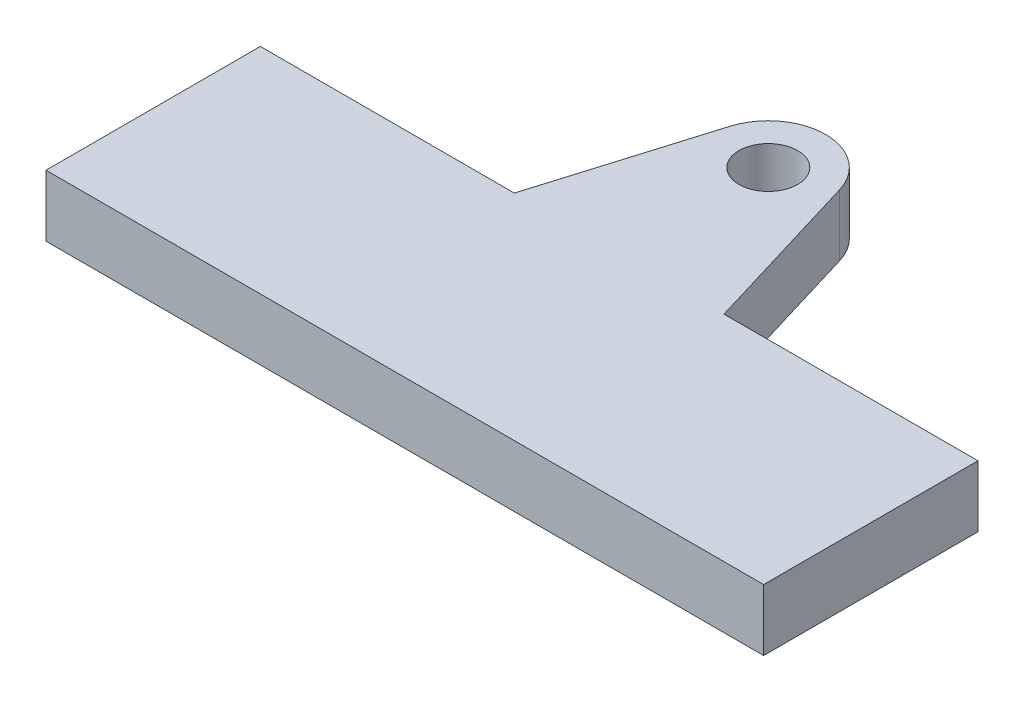
ISO-10303-21;
HEADER;
FILE_DESCRIPTION(('STEP AP214'),'2;1');
FILE_NAME('part.step','',(''),(''),'','','');
FILE_SCHEMA(('AUTOMOTIVE_DESIGN { 1 0 10303 214 1 1 1 1 }'));
ENDSEC;
DATA;
#1=APPLICATION_CONTEXT('core data for automotive mechanical design processes');
#2=APPLICATION_PROTOCOL_DEFINITION('international standard','automotive_design',2000,#1);
#3=PRODUCT_CONTEXT('',#1,'mechanical');
#4=PRODUCT('Part','Part','',(#3));
#5=PRODUCT_RELATED_PRODUCT_CATEGORY('part','',(#4));
#6=PRODUCT_DEFINITION_FORMATION('','',#4);
#7=PRODUCT_DEFINITION_CONTEXT('part definition',#1,'design');
#8=PRODUCT_DEFINITION('design','',#6,#7);
#9=PRODUCT_DEFINITION_SHAPE('','',#8);
#10=(LENGTH_UNIT() NAMED_UNIT(*) SI_UNIT(.MILLI.,.METRE.));
#11=(NAMED_UNIT(*) PLANE_ANGLE_UNIT() SI_UNIT($,.RADIAN.));
#12=(NAMED_UNIT(*) SI_UNIT($,.STERADIAN.) SOLID_ANGLE_UNIT());
#13=UNCERTAINTY_MEASURE_WITH_UNIT(LENGTH_MEASURE(1.E-05),#10,'distance_accuracy_value','');
#14=(GEOMETRIC_REPRESENTATION_CONTEXT(3) GLOBAL_UNCERTAINTY_ASSIGNED_CONTEXT((#13)) GLOBAL_UNIT_ASSIGNED_CONTEXT((#10,
#11,#12)) REPRESENTATION_CONTEXT('',''));
#15=CARTESIAN_POINT('',(0.,0.,0.));
#16=DIRECTION('',(0.,0.,1.));
#17=DIRECTION('',(1.,0.,0.));
#18=AXIS2_PLACEMENT_3D('',#15,#16,#17);
#19=CARTESIAN_POINT('',(0.,6.6,-16.));
#20=DIRECTION('',(0.,-1.,0.));
#21=DIRECTION('',(0.,0.,-1.));
#22=AXIS2_PLACEMENT_3D('',#19,#20,#21);
#23=CYLINDRICAL_SURFACE('',#22,6.15);
#24=CARTESIAN_POINT('',(0.,0.,-16.));
#25=DIRECTION('',(0.,1.,0.));
#26=DIRECTION('',(0.,0.,1.));
#27=AXIS2_PLACEMENT_3D('',#24,#25,#26);
#28=CIRCLE('',#27,6.15);
#29=CARTESIAN_POINT('',(-5.88800135866091,0.,-17.7759335574304));
#30=VERTEX_POINT('',#29);
#31=CARTESIAN_POINT('',(5.88800135866091,0.,-17.7759335574304));
#32=VERTEX_POINT('',#31);
#33=EDGE_CURVE('E197',#30,#32,#28,.F.);
#34=ORIENTED_EDGE('',*,*,#33,.F.);
#35=DIRECTION('',(0.,-1.,0.));
#36=VECTOR('',#35,1.);
#37=CARTESIAN_POINT('',(-5.88800135866091,6.6,-17.7759335574304));
#38=LINE('',#37,#36);
#39=CARTESIAN_POINT('',(-5.88800135866091,6.6,-17.7759335574304));
#40=VERTEX_POINT('',#39);
#41=EDGE_CURVE('E11',#40,#30,#38,.T.);
#42=ORIENTED_EDGE('',*,*,#41,.F.);
#43=CARTESIAN_POINT('',(0.,6.6,-16.));
#44=DIRECTION('',(0.,1.,0.));
#45=DIRECTION('',(0.,0.,1.));
#46=AXIS2_PLACEMENT_3D('',#43,#44,#45);
#47=CIRCLE('',#46,6.15);
#48=CARTESIAN_POINT('',(5.88800135866091,6.6,-17.7759335574304));
#49=VERTEX_POINT('',#48);
#50=EDGE_CURVE('E156',#40,#49,#47,.F.);
#51=ORIENTED_EDGE('',*,*,#50,.T.);
#52=DIRECTION('',(0.,-1.,0.));
#53=VECTOR('',#52,1.);
#54=CARTESIAN_POINT('',(5.88800135866091,6.6,-17.7759335574304));
#55=LINE('',#54,#53);
#56=EDGE_CURVE('E64',#49,#32,#55,.T.);
#57=ORIENTED_EDGE('',*,*,#56,.T.);
#58=EDGE_LOOP('',(#34,#42,#51,#57));
#59=FACE_BOUND('',#58,.T.);
#60=ADVANCED_FACE('F47',(#59),#23,.T.);
#61=CARTESIAN_POINT('',(-10.3114843961297,6.6,-3.11014044503737));
#62=DIRECTION('',(-0.957398594904213,0.,-0.288769684135018));
#63=DIRECTION('',(-0.288769684135018,0.,0.957398594904213));
#64=AXIS2_PLACEMENT_3D('',#61,#62,#63);
#65=PLANE('',#64);
#66=DIRECTION('',(0.288769684135018,0.,-0.957398594904213));
#67=VECTOR('',#66,1.);
#68=CARTESIAN_POINT('',(-10.3114843961297,0.,-3.11014044503737));
#69=LINE('',#68,#67);
#70=CARTESIAN_POINT('',(-11.2495620982584,0.,0.));
#71=VERTEX_POINT('',#70);
#72=EDGE_CURVE('E193',#71,#30,#69,.T.);
#73=ORIENTED_EDGE('',*,*,#72,.F.);
#74=DIRECTION('',(0.,-1.,0.));
#75=VECTOR('',#74,1.);
#76=CARTESIAN_POINT('',(-11.2495620982584,6.6,0.));
#77=LINE('',#76,#75);
#78=CARTESIAN_POINT('',(-11.2495620982584,6.6,0.));
#79=VERTEX_POINT('',#78);
#80=EDGE_CURVE('E56',#79,#71,#77,.T.);
#81=ORIENTED_EDGE('',*,*,#80,.F.);
#82=DIRECTION('',(0.288769684135018,0.,-0.957398594904213));
#83=VECTOR('',#82,1.);
#84=CARTESIAN_POINT('',(-10.3114843961297,6.6,-3.11014044503737));
#85=LINE('',#84,#83);
#86=EDGE_CURVE('E150',#79,#40,#85,.T.);
#87=ORIENTED_EDGE('',*,*,#86,.T.);
#88=ORIENTED_EDGE('',*,*,#41,.T.);
#89=EDGE_LOOP('',(#73,#81,#87,#88));
#90=FACE_BOUND('',#89,.T.);
#91=ADVANCED_FACE('F194',(#90),#65,.T.);
#92=CARTESIAN_POINT('',(0.,6.6,0.));
#93=DIRECTION('',(0.,0.,-1.));
#94=DIRECTION('',(-1.,0.,0.));
#95=AXIS2_PLACEMENT_3D('',#92,#93,#94);
#96=PLANE('',#95);
#97=DIRECTION('',(1.,0.,0.));
#98=VECTOR('',#97,1.);
#99=CARTESIAN_POINT('',(0.,0.,0.));
#100=LINE('',#99,#98);
#101=CARTESIAN_POINT('',(-38.5,0.,0.));
#102=VERTEX_POINT('',#101);
#103=EDGE_CURVE('E191',#102,#71,#100,.T.);
#104=ORIENTED_EDGE('',*,*,#103,.F.);
#105=DIRECTION('',(0.,-1.,0.));
#106=VECTOR('',#105,1.);
#107=CARTESIAN_POINT('',(-38.5,6.6,0.));
#108=LINE('',#107,#106);
#109=CARTESIAN_POINT('',(-38.5,6.6,0.));
#110=VERTEX_POINT('',#109);
#111=EDGE_CURVE('E184',#110,#102,#108,.T.);
#112=ORIENTED_EDGE('',*,*,#111,.F.);
#113=DIRECTION('',(1.,0.,0.));
#114=VECTOR('',#113,1.);
#115=CARTESIAN_POINT('',(0.,6.6,0.));
#116=LINE('',#115,#114);
#117=EDGE_CURVE('E141',#110,#79,#116,.T.);
#118=ORIENTED_EDGE('',*,*,#117,.T.);
#119=ORIENTED_EDGE('',*,*,#80,.T.);
#120=EDGE_LOOP('',(#104,#112,#118,#119));
#121=FACE_BOUND('',#120,.T.);
#122=ADVANCED_FACE('F189',(#121),#96,.T.);
#123=CARTESIAN_POINT('',(-38.5,6.6,0.));
#124=DIRECTION('',(1.,0.,0.));
#125=DIRECTION('',(0.,0.,-1.));
#126=AXIS2_PLACEMENT_3D('',#123,#124,#125);
#127=PLANE('',#126);
#128=DIRECTION('',(0.,0.,1.));
#129=VECTOR('',#128,1.);
#130=CARTESIAN_POINT('',(-38.5,0.,0.));
#131=LINE('',#130,#129);
#132=CARTESIAN_POINT('',(-38.5,0.,23.));
#133=VERTEX_POINT('',#132);
#134=EDGE_CURVE('E202',#102,#133,#131,.T.);
#135=ORIENTED_EDGE('',*,*,#134,.T.);
#136=DIRECTION('',(0.,-1.,0.));
#137=VECTOR('',#136,1.);
#138=CARTESIAN_POINT('',(-38.5,6.6,23.));
#139=LINE('',#138,#137);
#140=CARTESIAN_POINT('',(-38.5,6.6,23.));
#141=VERTEX_POINT('',#140);
#142=EDGE_CURVE('E180',#141,#133,#139,.T.);
#143=ORIENTED_EDGE('',*,*,#142,.F.);
#144=DIRECTION('',(0.,0.,1.));
#145=VECTOR('',#144,1.);
#146=CARTESIAN_POINT('',(-38.5,6.6,0.));
#147=LINE('',#146,#145);
#148=EDGE_CURVE('E149',#110,#141,#147,.T.);
#149=ORIENTED_EDGE('',*,*,#148,.F.);
#150=ORIENTED_EDGE('',*,*,#111,.T.);
#151=EDGE_LOOP('',(#135,#143,#149,#150));
#152=FACE_BOUND('',#151,.T.);
#153=ADVANCED_FACE('F218',(#152),#127,.F.);
#154=CARTESIAN_POINT('',(0.,6.6,23.));
#155=DIRECTION('',(0.,0.,-1.));
#156=DIRECTION('',(-1.,0.,0.));
#157=AXIS2_PLACEMENT_3D('',#154,#155,#156);
#158=PLANE('',#157);
#159=DIRECTION('',(1.,0.,0.));
#160=VECTOR('',#159,1.);
#161=CARTESIAN_POINT('',(0.,0.,23.));
#162=LINE('',#161,#160);
#163=CARTESIAN_POINT('',(38.5,0.,23.));
#164=VERTEX_POINT('',#163);
#165=EDGE_CURVE('E206',#133,#164,#162,.T.);
#166=ORIENTED_EDGE('',*,*,#165,.T.);
#167=DIRECTION('',(0.,-1.,0.));
#168=VECTOR('',#167,1.);
#169=CARTESIAN_POINT('',(38.5,6.6,23.));
#170=LINE('',#169,#168);
#171=CARTESIAN_POINT('',(38.5,6.6,23.));
#172=VERTEX_POINT('',#171);
#173=EDGE_CURVE('E124',#172,#164,#170,.T.);
#174=ORIENTED_EDGE('',*,*,#173,.F.);
#175=DIRECTION('',(1.,0.,0.));
#176=VECTOR('',#175,1.);
#177=CARTESIAN_POINT('',(0.,6.6,23.));
#178=LINE('',#177,#176);
#179=EDGE_CURVE('E133',#141,#172,#178,.T.);
#180=ORIENTED_EDGE('',*,*,#179,.F.);
#181=ORIENTED_EDGE('',*,*,#142,.T.);
#182=EDGE_LOOP('',(#166,#174,#180,#181));
#183=FACE_BOUND('',#182,.T.);
#184=ADVANCED_FACE('F214',(#183),#158,.F.);
#185=CARTESIAN_POINT('',(38.5,6.6,0.));
#186=DIRECTION('',(1.,0.,0.));
#187=DIRECTION('',(0.,0.,-1.));
#188=AXIS2_PLACEMENT_3D('',#185,#186,#187);
#189=PLANE('',#188);
#190=DIRECTION('',(0.,0.,1.));
#191=VECTOR('',#190,1.);
#192=CARTESIAN_POINT('',(38.5,0.,0.));
#193=LINE('',#192,#191);
#194=CARTESIAN_POINT('',(38.5,0.,0.));
#195=VERTEX_POINT('',#194);
#196=EDGE_CURVE('E119',#195,#164,#193,.T.);
#197=ORIENTED_EDGE('',*,*,#196,.F.);
#198=DIRECTION('',(0.,-1.,0.));
#199=VECTOR('',#198,1.);
#200=CARTESIAN_POINT('',(38.5,6.6,0.));
#201=LINE('',#200,#199);
#202=CARTESIAN_POINT('',(38.5,6.6,0.));
#203=VERTEX_POINT('',#202);
#204=EDGE_CURVE('E114',#203,#195,#201,.T.);
#205=ORIENTED_EDGE('',*,*,#204,.F.);
#206=DIRECTION('',(0.,0.,1.));
#207=VECTOR('',#206,1.);
#208=CARTESIAN_POINT('',(38.5,6.6,0.));
#209=LINE('',#208,#207);
#210=EDGE_CURVE('E117',#203,#172,#209,.T.);
#211=ORIENTED_EDGE('',*,*,#210,.T.);
#212=ORIENTED_EDGE('',*,*,#173,.T.);
#213=EDGE_LOOP('',(#197,#205,#211,#212));
#214=FACE_BOUND('',#213,.T.);
#215=ADVANCED_FACE('F116',(#214),#189,.T.);
#216=CARTESIAN_POINT('',(11.2495620982584,0.,0.));
#217=VERTEX_POINT('',#216);
#218=EDGE_CURVE('E170',#217,#195,#100,.T.);
#219=ORIENTED_EDGE('',*,*,#218,.F.);
#220=DIRECTION('',(0.,-1.,0.));
#221=VECTOR('',#220,1.);
#222=CARTESIAN_POINT('',(11.2495620982584,6.6,0.));
#223=LINE('',#222,#221);
#224=CARTESIAN_POINT('',(11.2495620982584,6.6,0.));
#225=VERTEX_POINT('',#224);
#226=EDGE_CURVE('E89',#225,#217,#223,.T.);
#227=ORIENTED_EDGE('',*,*,#226,.F.);
#228=EDGE_CURVE('E131',#225,#203,#116,.T.);
#229=ORIENTED_EDGE('',*,*,#228,.T.);
#230=ORIENTED_EDGE('',*,*,#204,.T.);
#231=EDGE_LOOP('',(#219,#227,#229,#230));
#232=FACE_BOUND('',#231,.T.);
#233=ADVANCED_FACE('F137',(#232),#96,.T.);
#234=CARTESIAN_POINT('',(10.3114843961297,6.6,-3.11014044503735));
#235=DIRECTION('',(0.957398594904214,0.,-0.288769684135017));
#236=DIRECTION('',(-0.288769684135017,0.,-0.957398594904214));
#237=AXIS2_PLACEMENT_3D('',#234,#235,#236);
#238=PLANE('',#237);
#239=DIRECTION('',(0.288769684135017,0.,0.957398594904214));
#240=VECTOR('',#239,1.);
#241=CARTESIAN_POINT('',(10.3114843961297,0.,-3.11014044503735));
#242=LINE('',#241,#240);
#243=EDGE_CURVE('E164',#32,#217,#242,.T.);
#244=ORIENTED_EDGE('',*,*,#243,.F.);
#245=ORIENTED_EDGE('',*,*,#56,.F.);
#246=DIRECTION('',(0.288769684135017,0.,0.957398594904214));
#247=VECTOR('',#246,1.);
#248=CARTESIAN_POINT('',(10.3114843961297,6.6,-3.11014044503735));
#249=LINE('',#248,#247);
#250=EDGE_CURVE('E139',#49,#225,#249,.T.);
#251=ORIENTED_EDGE('',*,*,#250,.T.);
#252=ORIENTED_EDGE('',*,*,#226,.T.);
#253=EDGE_LOOP('',(#244,#245,#251,#252));
#254=FACE_BOUND('',#253,.T.);
#255=ADVANCED_FACE('F219',(#254),#238,.T.);
#256=CARTESIAN_POINT('',(0.,6.6,-16.));
#257=DIRECTION('',(0.,-1.,0.));
#258=DIRECTION('',(0.,0.,-1.));
#259=AXIS2_PLACEMENT_3D('',#256,#257,#258);
#260=CYLINDRICAL_SURFACE('',#259,3.15);
#261=CARTESIAN_POINT('',(0.,6.6,-16.));
#262=DIRECTION('',(0.,1.,0.));
#263=DIRECTION('',(0.,0.,1.));
#264=AXIS2_PLACEMENT_3D('',#261,#262,#263);
#265=CIRCLE('',#264,3.15);
#266=CARTESIAN_POINT('',(0.,6.6,-12.85));
#267=VERTEX_POINT('',#266);
#268=EDGE_CURVE('E143',#267,#267,#265,.T.);
#269=ORIENTED_EDGE('',*,*,#268,.T.);
#270=EDGE_LOOP('',(#269));
#271=FACE_BOUND('',#270,.T.);
#272=CARTESIAN_POINT('',(0.,0.,-16.));
#273=DIRECTION('',(0.,1.,0.));
#274=DIRECTION('',(0.,0.,1.));
#275=AXIS2_PLACEMENT_3D('',#272,#273,#274);
#276=CIRCLE('',#275,3.15);
#277=CARTESIAN_POINT('',(0.,0.,-12.85));
#278=VERTEX_POINT('',#277);
#279=EDGE_CURVE('E160',#278,#278,#276,.T.);
#280=ORIENTED_EDGE('',*,*,#279,.F.);
#281=EDGE_LOOP('',(#280));
#282=FACE_BOUND('',#281,.T.);
#283=ADVANCED_FACE('F221',(#271,#282),#260,.F.);
#284=CARTESIAN_POINT('',(0.,6.6,0.));
#285=DIRECTION('',(0.,1.,0.));
#286=DIRECTION('',(0.,0.,1.));
#287=AXIS2_PLACEMENT_3D('',#284,#285,#286);
#288=PLANE('',#287);
#289=ORIENTED_EDGE('',*,*,#50,.F.);
#290=ORIENTED_EDGE('',*,*,#86,.F.);
#291=ORIENTED_EDGE('',*,*,#117,.F.);
#292=ORIENTED_EDGE('',*,*,#148,.T.);
#293=ORIENTED_EDGE('',*,*,#179,.T.);
#294=ORIENTED_EDGE('',*,*,#210,.F.);
#295=ORIENTED_EDGE('',*,*,#228,.F.);
#296=ORIENTED_EDGE('',*,*,#250,.F.);
#297=EDGE_LOOP('',(#289,#290,#291,#292,#293,#294,#295,#296));
#298=FACE_BOUND('',#297,.T.);
#299=ORIENTED_EDGE('',*,*,#268,.F.);
#300=EDGE_LOOP('',(#299));
#301=FACE_BOUND('',#300,.T.);
#302=ADVANCED_FACE('F128',(#298,#301),#288,.T.);
#303=CARTESIAN_POINT('',(0.,0.,0.));
#304=DIRECTION('',(0.,1.,0.));
#305=DIRECTION('',(0.,0.,1.));
#306=AXIS2_PLACEMENT_3D('',#303,#304,#305);
#307=PLANE('',#306);
#308=ORIENTED_EDGE('',*,*,#33,.T.);
#309=ORIENTED_EDGE('',*,*,#243,.T.);
#310=ORIENTED_EDGE('',*,*,#218,.T.);
#311=ORIENTED_EDGE('',*,*,#196,.T.);
#312=ORIENTED_EDGE('',*,*,#165,.F.);
#313=ORIENTED_EDGE('',*,*,#134,.F.);
#314=ORIENTED_EDGE('',*,*,#103,.T.);
#315=ORIENTED_EDGE('',*,*,#72,.T.);
#316=EDGE_LOOP('',(#308,#309,#310,#311,#312,#313,#314,#315));
#317=FACE_BOUND('',#316,.T.);
#318=ORIENTED_EDGE('',*,*,#279,.T.);
#319=EDGE_LOOP('',(#318));
#320=FACE_BOUND('',#319,.T.);
#321=ADVANCED_FACE('F200',(#317,#320),#307,.F.);
#322=CLOSED_SHELL('',(#60,#91,#122,#153,#184,#215,#233,#255,#283,#302,#321));
#323=MANIFOLD_SOLID_BREP('B2',#322);
#324=ADVANCED_BREP_SHAPE_REPRESENTATION('',(#18,#323),#14);
#325=SHAPE_DEFINITION_REPRESENTATION(#9,#324);
ENDSEC;
END-ISO-10303-21;
